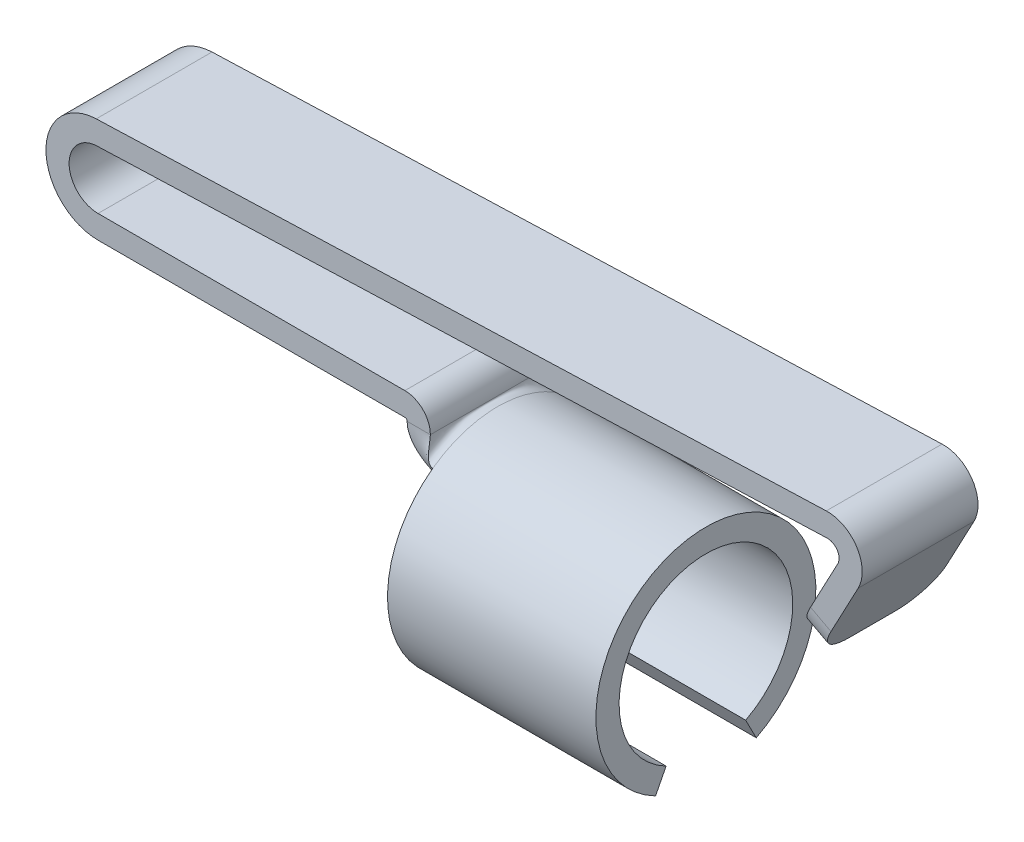
ISO-10303-21;
HEADER;
FILE_DESCRIPTION(('STEP AP214'),'2;1');
FILE_NAME('part.step','',(''),(''),'','','');
FILE_SCHEMA(('AUTOMOTIVE_DESIGN { 1 0 10303 214 1 1 1 1 }'));
ENDSEC;
DATA;
#1=APPLICATION_CONTEXT('core data for automotive mechanical design processes');
#2=APPLICATION_PROTOCOL_DEFINITION('international standard','automotive_design',2000,#1);
#3=PRODUCT_CONTEXT('',#1,'mechanical');
#4=PRODUCT('Part','Part','',(#3));
#5=PRODUCT_RELATED_PRODUCT_CATEGORY('part','',(#4));
#6=PRODUCT_DEFINITION_FORMATION('','',#4);
#7=PRODUCT_DEFINITION_CONTEXT('part definition',#1,'design');
#8=PRODUCT_DEFINITION('design','',#6,#7);
#9=PRODUCT_DEFINITION_SHAPE('','',#8);
#10=(LENGTH_UNIT() NAMED_UNIT(*) SI_UNIT(.MILLI.,.METRE.));
#11=(NAMED_UNIT(*) PLANE_ANGLE_UNIT() SI_UNIT($,.RADIAN.));
#12=(NAMED_UNIT(*) SI_UNIT($,.STERADIAN.) SOLID_ANGLE_UNIT());
#13=UNCERTAINTY_MEASURE_WITH_UNIT(LENGTH_MEASURE(1.E-05),#10,'distance_accuracy_value','');
#14=(GEOMETRIC_REPRESENTATION_CONTEXT(3) GLOBAL_UNCERTAINTY_ASSIGNED_CONTEXT((#13)) GLOBAL_UNIT_ASSIGNED_CONTEXT((#10,
#11,#12)) REPRESENTATION_CONTEXT('',''));
#15=CARTESIAN_POINT('',(0.,0.,0.));
#16=DIRECTION('',(0.,0.,1.));
#17=DIRECTION('',(1.,0.,0.));
#18=AXIS2_PLACEMENT_3D('',#15,#16,#17);
#19=CARTESIAN_POINT('',(7.493,-5.75197248490652,-1.1049));
#20=DIRECTION('',(0.,0.457894736842104,-0.889006417284094));
#21=DIRECTION('',(0.,0.889006417284094,0.457894736842104));
#22=AXIS2_PLACEMENT_3D('',#19,#20,#21);
#23=PLANE('',#22);
#24=DIRECTION('',(1.,0.,0.));
#25=VECTOR('',#24,1.);
#26=CARTESIAN_POINT('',(7.493,-5.3003572249262,-0.872289473684211));
#27=LINE('',#26,#25);
#28=CARTESIAN_POINT('',(12.065,-5.3003572249262,-0.872289473684211));
#29=VERTEX_POINT('',#28);
#30=CARTESIAN_POINT('',(7.493,-5.3003572249262,-0.872289473684211));
#31=VERTEX_POINT('',#30);
#32=EDGE_CURVE('E186',#29,#31,#27,.F.);
#33=ORIENTED_EDGE('',*,*,#32,.T.);
#34=DIRECTION('',(0.,0.889006417284094,0.457894736842104));
#35=VECTOR('',#34,1.);
#36=CARTESIAN_POINT('',(7.493,-5.75197248490652,-1.1049));
#37=LINE('',#36,#35);
#38=CARTESIAN_POINT('',(7.493,-5.75197248490652,-1.1049));
#39=VERTEX_POINT('',#38);
#40=EDGE_CURVE('E181',#39,#31,#37,.T.);
#41=ORIENTED_EDGE('',*,*,#40,.F.);
#42=DIRECTION('',(1.,0.,0.));
#43=VECTOR('',#42,1.);
#44=CARTESIAN_POINT('',(7.493,-5.75197248490652,-1.1049));
#45=LINE('',#44,#43);
#46=CARTESIAN_POINT('',(12.065,-5.75197248490652,-1.1049));
#47=VERTEX_POINT('',#46);
#48=EDGE_CURVE('E167',#47,#39,#45,.F.);
#49=ORIENTED_EDGE('',*,*,#48,.F.);
#50=DIRECTION('',(0.,-0.889006417284094,-0.457894736842104));
#51=VECTOR('',#50,1.);
#52=CARTESIAN_POINT('',(12.065,-5.3003572249262,-0.872289473684211));
#53=LINE('',#52,#51);
#54=EDGE_CURVE('E178',#29,#47,#53,.T.);
#55=ORIENTED_EDGE('',*,*,#54,.F.);
#56=EDGE_LOOP('',(#33,#41,#49,#55));
#57=FACE_BOUND('',#56,.T.);
#58=ADVANCED_FACE('F17',(#57),#23,.F.);
#59=CARTESIAN_POINT('',(7.493,-5.3003572249262,0.87228947368421));
#60=DIRECTION('',(0.,0.457894736842105,0.889006417284093));
#61=DIRECTION('',(0.,-0.889006417284093,0.457894736842105));
#62=AXIS2_PLACEMENT_3D('',#59,#60,#61);
#63=PLANE('',#62);
#64=DIRECTION('',(1.,0.,0.));
#65=VECTOR('',#64,1.);
#66=CARTESIAN_POINT('',(7.493,-5.75197248490652,1.1049));
#67=LINE('',#66,#65);
#68=CARTESIAN_POINT('',(7.493,-5.75197248490652,1.1049));
#69=VERTEX_POINT('',#68);
#70=CARTESIAN_POINT('',(12.065,-5.75197248490652,1.1049));
#71=VERTEX_POINT('',#70);
#72=EDGE_CURVE('E169',#69,#71,#67,.T.);
#73=ORIENTED_EDGE('',*,*,#72,.F.);
#74=DIRECTION('',(0.,0.889006417284093,-0.457894736842105));
#75=VECTOR('',#74,1.);
#76=CARTESIAN_POINT('',(7.493,-5.75197248490652,1.1049));
#77=LINE('',#76,#75);
#78=CARTESIAN_POINT('',(7.493,-5.3003572249262,0.87228947368421));
#79=VERTEX_POINT('',#78);
#80=EDGE_CURVE('E275',#69,#79,#77,.T.);
#81=ORIENTED_EDGE('',*,*,#80,.T.);
#82=DIRECTION('',(1.,0.,0.));
#83=VECTOR('',#82,1.);
#84=CARTESIAN_POINT('',(7.493,-5.3003572249262,0.87228947368421));
#85=LINE('',#84,#83);
#86=CARTESIAN_POINT('',(12.065,-5.3003572249262,0.87228947368421));
#87=VERTEX_POINT('',#86);
#88=EDGE_CURVE('E195',#79,#87,#85,.T.);
#89=ORIENTED_EDGE('',*,*,#88,.T.);
#90=DIRECTION('',(0.,0.889006417284093,-0.457894736842105));
#91=VECTOR('',#90,1.);
#92=CARTESIAN_POINT('',(12.065,-5.75197248490652,1.1049));
#93=LINE('',#92,#91);
#94=EDGE_CURVE('E182',#71,#87,#93,.T.);
#95=ORIENTED_EDGE('',*,*,#94,.F.);
#96=EDGE_LOOP('',(#73,#81,#89,#95));
#97=FACE_BOUND('',#96,.T.);
#98=ADVANCED_FACE('F274',(#97),#63,.F.);
#99=CARTESIAN_POINT('',(12.065,-3.6068,0.));
#100=DIRECTION('',(1.,0.,0.));
#101=DIRECTION('',(0.,0.,-1.));
#102=AXIS2_PLACEMENT_3D('',#99,#100,#101);
#103=PLANE('',#102);
#104=CARTESIAN_POINT('',(12.065,-3.6068,0.));
#105=DIRECTION('',(1.,0.,0.));
#106=DIRECTION('',(0.,0.,-1.));
#107=AXIS2_PLACEMENT_3D('',#104,#105,#106);
#108=CIRCLE('',#107,1.905);
#109=EDGE_CURVE('E185',#87,#29,#108,.F.);
#110=ORIENTED_EDGE('',*,*,#109,.T.);
#111=ORIENTED_EDGE('',*,*,#54,.T.);
#112=CARTESIAN_POINT('',(12.065,-3.6068,0.));
#113=DIRECTION('',(1.,0.,0.));
#114=DIRECTION('',(0.,0.,-1.));
#115=AXIS2_PLACEMENT_3D('',#112,#113,#114);
#116=CIRCLE('',#115,2.413);
#117=EDGE_CURVE('E160',#71,#47,#116,.F.);
#118=ORIENTED_EDGE('',*,*,#117,.F.);
#119=ORIENTED_EDGE('',*,*,#94,.T.);
#120=EDGE_LOOP('',(#110,#111,#118,#119));
#121=FACE_BOUND('',#120,.T.);
#122=ADVANCED_FACE('F184',(#121),#103,.T.);
#123=CARTESIAN_POINT('',(7.493,-3.6068,0.));
#124=DIRECTION('',(1.,0.,0.));
#125=DIRECTION('',(0.,0.,-1.));
#126=AXIS2_PLACEMENT_3D('',#123,#124,#125);
#127=PLANE('',#126);
#128=CARTESIAN_POINT('',(7.493,-3.6068,0.));
#129=DIRECTION('',(1.,0.,0.));
#130=DIRECTION('',(0.,0.,-1.));
#131=AXIS2_PLACEMENT_3D('',#128,#129,#130);
#132=CIRCLE('',#131,1.905);
#133=CARTESIAN_POINT('',(7.493,-2.06624587666632,-1.12058823529412));
#134=VERTEX_POINT('',#133);
#135=EDGE_CURVE('E253',#31,#134,#132,.T.);
#136=ORIENTED_EDGE('',*,*,#135,.T.);
#137=DIRECTION('',(0.,-0.808689828645061,0.588235293947942));
#138=VECTOR('',#137,1.);
#139=CARTESIAN_POINT('',(7.493,-1.65543215417093,-1.41941124783875));
#140=LINE('',#139,#138);
#141=CARTESIAN_POINT('',(7.493,-1.6554316805543,-1.4194115923881));
#142=VERTEX_POINT('',#141);
#143=EDGE_CURVE('E188',#142,#134,#140,.T.);
#144=ORIENTED_EDGE('',*,*,#143,.F.);
#145=CARTESIAN_POINT('',(7.493,-3.6068,0.));
#146=DIRECTION('',(1.,0.,0.));
#147=DIRECTION('',(0.,0.,-1.));
#148=AXIS2_PLACEMENT_3D('',#145,#146,#147);
#149=CIRCLE('',#148,2.413);
#150=EDGE_CURVE('E171',#39,#142,#149,.T.);
#151=ORIENTED_EDGE('',*,*,#150,.F.);
#152=ORIENTED_EDGE('',*,*,#40,.T.);
#153=EDGE_LOOP('',(#136,#144,#151,#152));
#154=FACE_BOUND('',#153,.T.);
#155=ADVANCED_FACE('F304',(#154),#127,.F.);
#156=CARTESIAN_POINT('',(7.493,-3.6068,0.));
#157=DIRECTION('',(1.,0.,0.));
#158=DIRECTION('',(0.,0.,-1.));
#159=AXIS2_PLACEMENT_3D('',#156,#157,#158);
#160=PLANE('',#159);
#161=DIRECTION('',(0.,0.808689828521618,0.588235294117649));
#162=VECTOR('',#161,1.);
#163=CARTESIAN_POINT('',(7.493,-2.06624587666632,1.12058823529412));
#164=LINE('',#163,#162);
#165=CARTESIAN_POINT('',(7.493,-2.06624587666632,1.12058823529412));
#166=VERTEX_POINT('',#165);
#167=CARTESIAN_POINT('',(7.493,-1.65543144377733,1.41941176470588));
#168=VERTEX_POINT('',#167);
#169=EDGE_CURVE('E198',#166,#168,#164,.T.);
#170=ORIENTED_EDGE('',*,*,#169,.F.);
#171=CARTESIAN_POINT('',(7.493,-3.6068,0.));
#172=DIRECTION('',(1.,0.,0.));
#173=DIRECTION('',(0.,0.,-1.));
#174=AXIS2_PLACEMENT_3D('',#171,#172,#173);
#175=CIRCLE('',#174,1.905);
#176=EDGE_CURVE('E251',#166,#79,#175,.T.);
#177=ORIENTED_EDGE('',*,*,#176,.T.);
#178=ORIENTED_EDGE('',*,*,#80,.F.);
#179=CARTESIAN_POINT('',(7.493,-3.6068,0.));
#180=DIRECTION('',(1.,0.,0.));
#181=DIRECTION('',(0.,0.,-1.));
#182=AXIS2_PLACEMENT_3D('',#179,#180,#181);
#183=CIRCLE('',#182,2.413);
#184=EDGE_CURVE('E172',#168,#69,#183,.T.);
#185=ORIENTED_EDGE('',*,*,#184,.F.);
#186=EDGE_LOOP('',(#170,#177,#178,#185));
#187=FACE_BOUND('',#186,.T.);
#188=ADVANCED_FACE('F277',(#187),#160,.F.);
#189=CARTESIAN_POINT('',(7.493,-3.6068,0.));
#190=DIRECTION('',(1.,0.,0.));
#191=DIRECTION('',(0.,0.,-1.));
#192=AXIS2_PLACEMENT_3D('',#189,#190,#191);
#193=CYLINDRICAL_SURFACE('',#192,2.413);
#194=ORIENTED_EDGE('',*,*,#150,.T.);
#195=CARTESIAN_POINT('',(7.493,-1.65543144377733,1.41941176470588));
#196=CARTESIAN_POINT('',(7.493,-1.57851395081652,1.31366769457813));
#197=CARTESIAN_POINT('',(7.493,-1.44390833813508,1.09277437162431));
#198=CARTESIAN_POINT('',(7.493,-1.29968803883354,0.740272726122418));
#199=CARTESIAN_POINT('',(7.493,-1.21315585925262,0.373663306573072));
#200=CARTESIAN_POINT('',(7.493,-1.18431179939231,0.));
#201=CARTESIAN_POINT('',(7.493,-1.21315585925262,-0.373663306573072));
#202=CARTESIAN_POINT('',(7.493,-1.32853209869385,-0.862475865972201));
#203=CARTESIAN_POINT('',(7.493,-1.5015964578557,-1.20792362445037));
#204=CARTESIAN_POINT('',(7.493,-1.65543144377733,-1.41941176470589));
#205=B_SPLINE_CURVE_WITH_KNOTS('',3,(#195,#196,#197,#198,#199,#200,#201,#202,#203,#204),
.UNSPECIFIED.,.F.,.F.,(4,1,1,1,1,1,1,4),(0.,0.125,0.25,0.375,0.5,0.625,0.75,1.),.UNSPECIFIED.);
#206=EDGE_CURVE('E266',#168,#142,#205,.T.);
#207=ORIENTED_EDGE('',*,*,#206,.F.);
#208=ORIENTED_EDGE('',*,*,#184,.T.);
#209=ORIENTED_EDGE('',*,*,#72,.T.);
#210=ORIENTED_EDGE('',*,*,#117,.T.);
#211=ORIENTED_EDGE('',*,*,#48,.T.);
#212=EDGE_LOOP('',(#194,#207,#208,#209,#210,#211));
#213=FACE_BOUND('',#212,.T.);
#214=ADVANCED_FACE('F166',(#213),#193,.T.);
#215=CARTESIAN_POINT('',(7.493,-3.6068,0.));
#216=DIRECTION('',(1.,0.,0.));
#217=DIRECTION('',(0.,0.,-1.));
#218=AXIS2_PLACEMENT_3D('',#215,#216,#217);
#219=CYLINDRICAL_SURFACE('',#218,1.905);
#220=ORIENTED_EDGE('',*,*,#176,.F.);
#221=CARTESIAN_POINT('',(7.493,-2.06624587666632,-1.12058823529412));
#222=CARTESIAN_POINT('',(7.493,-2.0055215401183,-1.03710607466694));
#223=CARTESIAN_POINT('',(7.493,-1.89925395115927,-0.862716609177091));
#224=CARTESIAN_POINT('',(7.493,-1.78539582013175,-0.584425836412436));
#225=CARTESIAN_POINT('',(7.493,-1.71708094151523,-0.294997347294531));
#226=CARTESIAN_POINT('',(7.493,-1.68671877324122,0.0983324490981756));
#227=CARTESIAN_POINT('',(7.493,-1.76262419392624,0.589994694589059));
#228=CARTESIAN_POINT('',(7.493,-1.94479720357029,0.953623914039765));
#229=CARTESIAN_POINT('',(7.493,-2.06624587666632,1.12058823529412));
#230=B_SPLINE_CURVE_WITH_KNOTS('',3,(#221,#222,#223,#224,#225,#226,#227,#228,#229),
.UNSPECIFIED.,.F.,.F.,(4,1,1,1,1,1,4),(0.,0.125,0.25,0.375,0.5,0.75,1.),.UNSPECIFIED.);
#231=EDGE_CURVE('E353',#134,#166,#230,.T.);
#232=ORIENTED_EDGE('',*,*,#231,.F.);
#233=ORIENTED_EDGE('',*,*,#135,.F.);
#234=ORIENTED_EDGE('',*,*,#32,.F.);
#235=ORIENTED_EDGE('',*,*,#109,.F.);
#236=ORIENTED_EDGE('',*,*,#88,.F.);
#237=EDGE_LOOP('',(#220,#232,#233,#234,#235,#236));
#238=FACE_BOUND('',#237,.T.);
#239=ADVANCED_FACE('F299',(#238),#219,.F.);
#240=CARTESIAN_POINT('',(16.2262686885862,0.820788612837237,1.27));
#241=DIRECTION('',(0.882947592858926,-0.469471562785893,0.));
#242=DIRECTION('',(0.469471562785893,0.882947592858926,0.));
#243=AXIS2_PLACEMENT_3D('',#240,#241,#242);
#244=PLANE('',#243);
#245=CARTESIAN_POINT('',(15.6300398038481,-0.300554830093601,-0.508));
#246=DIRECTION('',(-0.882947592858926,0.469471562785892,0.));
#247=DIRECTION('',(-0.469471562785892,-0.882947592858926,0.));
#248=AXIS2_PLACEMENT_3D('',#245,#246,#247);
#249=CIRCLE('',#248,0.762);
#250=CARTESIAN_POINT('',(15.2723024730052,-0.973360895852102,-0.508));
#251=VERTEX_POINT('',#250);
#252=CARTESIAN_POINT('',(15.6300398038481,-0.300554830093601,-1.27));
#253=VERTEX_POINT('',#252);
#254=EDGE_CURVE('E244',#251,#253,#249,.F.);
#255=ORIENTED_EDGE('',*,*,#254,.F.);
#256=DIRECTION('',(0.,0.,1.));
#257=VECTOR('',#256,1.);
#258=CARTESIAN_POINT('',(15.2723024730052,-0.973360895852101,1.27));
#259=LINE('',#258,#257);
#260=CARTESIAN_POINT('',(15.2723024730052,-0.973360895852101,0.508));
#261=VERTEX_POINT('',#260);
#262=EDGE_CURVE('E247',#261,#251,#259,.F.);
#263=ORIENTED_EDGE('',*,*,#262,.F.);
#264=CARTESIAN_POINT('',(15.6300398038481,-0.3005548300936,0.508));
#265=DIRECTION('',(0.882947592858926,-0.469471562785892,0.));
#266=DIRECTION('',(0.469471562785892,0.882947592858926,0.));
#267=AXIS2_PLACEMENT_3D('',#264,#265,#266);
#268=CIRCLE('',#267,0.762);
#269=CARTESIAN_POINT('',(15.6300398038481,-0.3005548300936,1.27));
#270=VERTEX_POINT('',#269);
#271=EDGE_CURVE('E248',#270,#261,#268,.T.);
#272=ORIENTED_EDGE('',*,*,#271,.F.);
#273=DIRECTION('',(0.469471562785893,0.882947592858926,0.));
#274=VECTOR('',#273,1.);
#275=CARTESIAN_POINT('',(16.2262686885862,0.820788612837237,1.27));
#276=LINE('',#275,#274);
#277=CARTESIAN_POINT('',(16.2262686885862,0.820788612837237,1.27));
#278=VERTEX_POINT('',#277);
#279=EDGE_CURVE('E250',#278,#270,#276,.F.);
#280=ORIENTED_EDGE('',*,*,#279,.F.);
#281=DIRECTION('',(0.,0.,-1.));
#282=VECTOR('',#281,1.);
#283=CARTESIAN_POINT('',(16.2262686885862,0.820788612837239,1.27));
#284=LINE('',#283,#282);
#285=CARTESIAN_POINT('',(16.2262686885862,0.820788612837237,-1.27));
#286=VERTEX_POINT('',#285);
#287=EDGE_CURVE('E240',#278,#286,#284,.T.);
#288=ORIENTED_EDGE('',*,*,#287,.T.);
#289=DIRECTION('',(0.469471562785893,0.882947592858926,0.));
#290=VECTOR('',#289,1.);
#291=CARTESIAN_POINT('',(16.2262686885862,0.820788612837237,-1.27));
#292=LINE('',#291,#290);
#293=EDGE_CURVE('E246',#253,#286,#292,.T.);
#294=ORIENTED_EDGE('',*,*,#293,.F.);
#295=EDGE_LOOP('',(#255,#263,#272,#280,#288,#294));
#296=FACE_BOUND('',#295,.T.);
#297=ADVANCED_FACE('F321',(#296),#244,.F.);
#298=CARTESIAN_POINT('',(7.2898,-1.1938,-1.27));
#299=CARTESIAN_POINT('',(7.29591950625445,-1.36903973106871,-1.27));
#300=CARTESIAN_POINT('',(7.31765345255229,-1.65543144377733,-1.41941176470589));
#301=CARTESIAN_POINT('',(7.493,-1.65543144377733,-1.41941176470589));
#302=CARTESIAN_POINT('',(7.2898,-1.1938,-1.05833333333333));
#303=CARTESIAN_POINT('',(7.29463998980931,-1.33245143373405,-1.05833150838552));
#304=CARTESIAN_POINT('',(7.35426405207499,-1.5015964578557,-1.20792362445037));
#305=CARTESIAN_POINT('',(7.493,-1.5015964578557,-1.20792362445037));
#306=CARTESIAN_POINT('',(7.2898,-1.1938,-0.740833333333333));
#307=CARTESIAN_POINT('',(7.29272071514161,-1.27756898773207,-0.7408287709638));
#308=CARTESIAN_POINT('',(7.40917995135904,-1.32853209869385,-0.862475865972201));
#309=CARTESIAN_POINT('',(7.493,-1.32853209869385,-0.862475865972201));
#310=CARTESIAN_POINT('',(7.2898,-1.1938,-0.3175));
#311=CARTESIAN_POINT('',(7.29223178632728,-1.2632020806928,-0.317508212265159));
#312=CARTESIAN_POINT('',(7.42355561566459,-1.21315585925262,-0.373663306573072));
#313=CARTESIAN_POINT('',(7.493,-1.21315585925262,-0.373663306573072));
#314=CARTESIAN_POINT('',(7.2898,-1.1938,0.));
#315=CARTESIAN_POINT('',(7.29210615284979,-1.26074105638537,3.14803497769103E-05));
#316=CARTESIAN_POINT('',(7.42601814007536,-1.18431179939231,0.));
#317=CARTESIAN_POINT('',(7.493,-1.18431179939231,0.));
#318=CARTESIAN_POINT('',(7.2898,-1.1938,0.3175));
#319=CARTESIAN_POINT('',(7.29232676048123,-1.26278620455215,0.317382290866052));
#320=CARTESIAN_POINT('',(7.42397174530017,-1.21315585925262,0.373663306573072));
#321=CARTESIAN_POINT('',(7.493,-1.21315585925262,0.373663306573072));
#322=CARTESIAN_POINT('',(7.2898,-1.1938,0.635));
#323=CARTESIAN_POINT('',(7.29221858632226,-1.27564076553488,0.635439356186016));
#324=CARTESIAN_POINT('',(7.41110934889308,-1.29968803883354,0.740272726122418));
#325=CARTESIAN_POINT('',(7.493,-1.29968803883354,0.740272726122418));
#326=CARTESIAN_POINT('',(7.2898,-1.1938,0.9525));
#327=CARTESIAN_POINT('',(7.2954248438959,-1.30791914295686,0.950860284389884));
#328=CARTESIAN_POINT('',(7.37881129637017,-1.44390833813508,1.09277437162431));
#329=CARTESIAN_POINT('',(7.493,-1.44390833813508,1.09277437162431));
#330=CARTESIAN_POINT('',(7.2898,-1.1938,1.16416666666667));
#331=CARTESIAN_POINT('',(7.2916749479653,-1.34866620169809,1.16769976563293));
#332=CARTESIAN_POINT('',(7.33803940049159,-1.57851395081652,1.31366769457813));
#333=CARTESIAN_POINT('',(7.493,-1.57851395081652,1.31366769457813));
#334=CARTESIAN_POINT('',(7.2898,-1.1938,1.27));
#335=CARTESIAN_POINT('',(7.2898,-1.36903973106871,1.27611950625445));
#336=CARTESIAN_POINT('',(7.31765345255229,-1.65543144377733,1.41941176470588));
#337=CARTESIAN_POINT('',(7.493,-1.65543144377733,1.41941176470588));
#338=B_SPLINE_SURFACE_WITH_KNOTS('',3,3,((#298,#299,#300,#301),(#302,#303,#304,#305),(#306,#307,
#308,#309),(#310,#311,#312,#313),(#314,#315,#316,#317),(#318,#319,#320,#321),(#322,#323,#324,
#325),(#326,#327,#328,#329),(#330,#331,#332,#333),(#334,#335,#336,#337)),.UNSPECIFIED.,.F.,.F.,
.F.,(4,1,1,1,1,1,1,4),(4,4),(0.,0.25,0.375,0.5,0.625,0.75,0.875,1.),(0.,1.),.UNSPECIFIED.);
#339=CARTESIAN_POINT('',(7.2898,-1.1938,-1.27));
#340=CARTESIAN_POINT('',(7.29591950625445,-1.36903973106871,-1.27));
#341=CARTESIAN_POINT('',(7.31765345255229,-1.65543144377733,-1.41941176470589));
#342=CARTESIAN_POINT('',(7.493,-1.65543144377733,-1.41941176470589));
#343=B_SPLINE_CURVE_WITH_KNOTS('',3,(#339,#340,#341,#342),.UNSPECIFIED.,.F.,.F.,(4,4),(0.,1.),.UNSPECIFIED.);
#344=CARTESIAN_POINT('',(7.2898,-1.1938,-1.27));
#345=VERTEX_POINT('',#344);
#346=EDGE_CURVE('E384',#142,#345,#343,.F.);
#347=DIRECTION('',(0.,0.,1.));
#348=VECTOR('',#347,1.);
#349=CARTESIAN_POINT('',(7.2898,-1.1938,1.38722002645864));
#350=LINE('',#349,#348);
#351=CARTESIAN_POINT('',(7.2898,-1.1938,1.27));
#352=VERTEX_POINT('',#351);
#353=EDGE_CURVE('E234',#352,#345,#350,.F.);
#354=CARTESIAN_POINT('',(7.2898,-1.1938,1.27));
#355=CARTESIAN_POINT('',(7.2898,-1.36903973106871,1.27611950625445));
#356=CARTESIAN_POINT('',(7.31765345255229,-1.65543144377733,1.41941176470588));
#357=CARTESIAN_POINT('',(7.493,-1.65543144377733,1.41941176470588));
#358=B_SPLINE_CURVE_WITH_KNOTS('',3,(#354,#355,#356,#357),.UNSPECIFIED.,.F.,.F.,(4,4),(0.,1.),.UNSPECIFIED.);
#359=EDGE_CURVE('E369',#352,#168,#358,.T.);
#360=ORIENTED_EDGE('',*,*,#206,.T.);
#361=ORIENTED_EDGE('',*,*,#346,.T.);
#362=ORIENTED_EDGE('',*,*,#353,.F.);
#363=ORIENTED_EDGE('',*,*,#359,.T.);
#364=EDGE_LOOP('',(#360,#361,#362,#363));
#365=FACE_BOUND('',#364,.T.);
#366=ADVANCED_FACE('F314',(#365),#338,.T.);
#367=CARTESIAN_POINT('',(6.7818,-1.1938,1.27));
#368=CARTESIAN_POINT('',(6.76859089460419,-1.57205928775501,1.27));
#369=CARTESIAN_POINT('',(7.11451014645266,-2.06624587666632,1.12058823529412));
#370=CARTESIAN_POINT('',(7.493,-2.06624587666632,1.12058823529412));
#371=CARTESIAN_POINT('',(6.7818,-1.1938,1.05833333333333));
#372=CARTESIAN_POINT('',(6.76949594362787,-1.54571174556917,1.05834836075699));
#373=CARTESIAN_POINT('',(7.14087374863264,-1.94479720357029,0.953623914039765));
#374=CARTESIAN_POINT('',(7.493,-1.94479720357029,0.953623914039765));
#375=CARTESIAN_POINT('',(6.7818,-1.1938,0.635));
#376=CARTESIAN_POINT('',(6.77130604167525,-1.49301666119748,0.635045082270975));
#377=CARTESIAN_POINT('',(7.19360095299258,-1.76262419392624,0.589994694589059));
#378=CARTESIAN_POINT('',(7.493,-1.76262419392624,0.589994694589059));
#379=CARTESIAN_POINT('',(6.7818,-1.1938,0.105833333333333));
#380=CARTESIAN_POINT('',(6.77186053290836,-1.48251722367898,0.105690572808578));
#381=CARTESIAN_POINT('',(7.20410679038336,-1.68671877324122,0.0983324490981756));
#382=CARTESIAN_POINT('',(7.493,-1.68671877324122,0.0983324490981756));
#383=CARTESIAN_POINT('',(6.7818,-1.1938,-0.3175));
#384=CARTESIAN_POINT('',(6.77128577755434,-1.48778750671068,-0.317252047509635));
#385=CARTESIAN_POINT('',(7.19883329488067,-1.71708094151523,-0.294997347294531));
#386=CARTESIAN_POINT('',(7.493,-1.71708094151523,-0.294997347294531));
#387=CARTESIAN_POINT('',(6.7818,-1.1938,-0.635));
#388=CARTESIAN_POINT('',(6.77197288719171,-1.50232242535237,-0.635946727690484));
#389=CARTESIAN_POINT('',(7.1842895165622,-1.78539582013175,-0.584425836412436));
#390=CARTESIAN_POINT('',(7.493,-1.78539582013175,-0.584425836412436));
#391=CARTESIAN_POINT('',(6.7818,-1.1938,-0.9525));
#392=CARTESIAN_POINT('',(6.766609166139,-1.52746606060004,-0.948961041728428));
#393=CARTESIAN_POINT('',(7.15913055515502,-1.89925395115927,-0.862716609177091));
#394=CARTESIAN_POINT('',(7.493,-1.89925395115927,-0.862716609177091));
#395=CARTESIAN_POINT('',(6.7818,-1.1938,-1.16416666666667));
#396=CARTESIAN_POINT('',(6.77673638871299,-1.55719487870336,-1.17179308417335));
#397=CARTESIAN_POINT('',(7.12938361602011,-2.0055215401183,-1.03710607466694));
#398=CARTESIAN_POINT('',(7.493,-2.0055215401183,-1.03710607466694));
#399=CARTESIAN_POINT('',(6.7818,-1.1938,-1.27));
#400=CARTESIAN_POINT('',(6.7818,-1.57205928775501,-1.28320910539581));
#401=CARTESIAN_POINT('',(7.11451014645266,-2.06624587666632,-1.12058823529412));
#402=CARTESIAN_POINT('',(7.493,-2.06624587666632,-1.12058823529412));
#403=B_SPLINE_SURFACE_WITH_KNOTS('',3,3,((#367,#368,#369,#370),(#371,#372,#373,#374),(#375,#376,
#377,#378),(#379,#380,#381,#382),(#383,#384,#385,#386),(#387,#388,#389,#390),(#391,#392,#393,
#394),(#395,#396,#397,#398),(#399,#400,#401,#402)),.UNSPECIFIED.,.F.,.F.,.F.,(4,1,1,1,1,1,4),(4,
4),(0.,0.25,0.5,0.625,0.75,0.875,1.),(0.,1.),.UNSPECIFIED.);
#404=CARTESIAN_POINT('',(6.7818,-1.1938,1.27));
#405=CARTESIAN_POINT('',(6.76859089460419,-1.57205928775501,1.27));
#406=CARTESIAN_POINT('',(7.11451014645266,-2.06624587666632,1.12058823529412));
#407=CARTESIAN_POINT('',(7.493,-2.06624587666632,1.12058823529412));
#408=B_SPLINE_CURVE_WITH_KNOTS('',3,(#404,#405,#406,#407),.UNSPECIFIED.,.F.,.F.,(4,4),(0.,1.),.UNSPECIFIED.);
#409=CARTESIAN_POINT('',(6.7818,-1.1938,1.27));
#410=VERTEX_POINT('',#409);
#411=EDGE_CURVE('E243',#166,#410,#408,.F.);
#412=DIRECTION('',(0.,0.,1.));
#413=VECTOR('',#412,1.);
#414=CARTESIAN_POINT('',(6.7818,-1.1938,1.38722002645864));
#415=LINE('',#414,#413);
#416=CARTESIAN_POINT('',(6.7818,-1.1938,-1.27));
#417=VERTEX_POINT('',#416);
#418=EDGE_CURVE('E225',#410,#417,#415,.F.);
#419=CARTESIAN_POINT('',(6.7818,-1.1938,-1.27));
#420=CARTESIAN_POINT('',(6.7818,-1.57205928775501,-1.28320910539581));
#421=CARTESIAN_POINT('',(7.11451014645266,-2.06624587666632,-1.12058823529412));
#422=CARTESIAN_POINT('',(7.493,-2.06624587666632,-1.12058823529412));
#423=B_SPLINE_CURVE_WITH_KNOTS('',3,(#419,#420,#421,#422),.UNSPECIFIED.,.F.,.F.,(4,4),(0.,1.),.UNSPECIFIED.);
#424=EDGE_CURVE('E389',#417,#134,#423,.T.);
#425=ORIENTED_EDGE('',*,*,#231,.T.);
#426=ORIENTED_EDGE('',*,*,#411,.T.);
#427=ORIENTED_EDGE('',*,*,#418,.T.);
#428=ORIENTED_EDGE('',*,*,#424,.T.);
#429=EDGE_LOOP('',(#425,#426,#427,#428));
#430=FACE_BOUND('',#429,.T.);
#431=ADVANCED_FACE('F320',(#430),#403,.T.);
#432=CARTESIAN_POINT('',(16.002,0.940034389784854,1.27));
#433=DIRECTION('',(0.,0.,-1.));
#434=DIRECTION('',(-1.,0.,0.));
#435=AXIS2_PLACEMENT_3D('',#432,#433,#434);
#436=CYLINDRICAL_SURFACE('',#435,0.254000000000001);
#437=ORIENTED_EDGE('',*,*,#287,.F.);
#438=CARTESIAN_POINT('',(16.002,0.940034389784854,1.27));
#439=DIRECTION('',(0.,0.,-1.));
#440=DIRECTION('',(-1.,0.,0.));
#441=AXIS2_PLACEMENT_3D('',#438,#439,#440);
#442=CIRCLE('',#441,0.254000000000001);
#443=CARTESIAN_POINT('',(15.9931355278376,1.1938796598477,1.27));
#444=VERTEX_POINT('',#443);
#445=EDGE_CURVE('E241',#444,#278,#442,.T.);
#446=ORIENTED_EDGE('',*,*,#445,.F.);
#447=DIRECTION('',(0.,0.,1.));
#448=VECTOR('',#447,1.);
#449=CARTESIAN_POINT('',(15.9931355278376,1.1938796598477,1.27));
#450=LINE('',#449,#448);
#451=CARTESIAN_POINT('',(15.9931355278376,1.1938796598477,-1.27));
#452=VERTEX_POINT('',#451);
#453=EDGE_CURVE('E423',#444,#452,#450,.F.);
#454=ORIENTED_EDGE('',*,*,#453,.T.);
#455=CARTESIAN_POINT('',(16.002,0.940034389784854,-1.27));
#456=DIRECTION('',(0.,0.,-1.));
#457=DIRECTION('',(-1.,0.,0.));
#458=AXIS2_PLACEMENT_3D('',#455,#456,#457);
#459=CIRCLE('',#458,0.254000000000001);
#460=EDGE_CURVE('E238',#286,#452,#459,.F.);
#461=ORIENTED_EDGE('',*,*,#460,.F.);
#462=EDGE_LOOP('',(#437,#446,#454,#461));
#463=FACE_BOUND('',#462,.T.);
#464=ADVANCED_FACE('F572',(#463),#436,.F.);
#465=CARTESIAN_POINT('',(6.731,-1.1938,1.38722002645864));
#466=DIRECTION('',(0.,0.,1.));
#467=DIRECTION('',(1.,0.,0.));
#468=AXIS2_PLACEMENT_3D('',#465,#466,#467);
#469=CYLINDRICAL_SURFACE('',#468,0.5588);
#470=CARTESIAN_POINT('',(6.731,-1.1938,-1.27));
#471=DIRECTION('',(0.,0.,1.));
#472=DIRECTION('',(1.,0.,0.));
#473=AXIS2_PLACEMENT_3D('',#470,#471,#472);
#474=CIRCLE('',#473,0.5588);
#475=CARTESIAN_POINT('',(6.731,-0.635,-1.27));
#476=VERTEX_POINT('',#475);
#477=EDGE_CURVE('E232',#345,#476,#474,.T.);
#478=ORIENTED_EDGE('',*,*,#477,.T.);
#479=DIRECTION('',(0.,0.,-1.));
#480=VECTOR('',#479,1.);
#481=CARTESIAN_POINT('',(6.731,-0.635,1.27));
#482=LINE('',#481,#480);
#483=CARTESIAN_POINT('',(6.731,-0.635,1.27));
#484=VERTEX_POINT('',#483);
#485=EDGE_CURVE('E426',#476,#484,#482,.F.);
#486=ORIENTED_EDGE('',*,*,#485,.T.);
#487=CARTESIAN_POINT('',(6.731,-1.1938,1.27));
#488=DIRECTION('',(0.,0.,1.));
#489=DIRECTION('',(1.,0.,0.));
#490=AXIS2_PLACEMENT_3D('',#487,#488,#489);
#491=CIRCLE('',#490,0.5588);
#492=EDGE_CURVE('E235',#484,#352,#491,.F.);
#493=ORIENTED_EDGE('',*,*,#492,.T.);
#494=ORIENTED_EDGE('',*,*,#353,.T.);
#495=EDGE_LOOP('',(#478,#486,#493,#494));
#496=FACE_BOUND('',#495,.T.);
#497=ADVANCED_FACE('F568',(#496),#469,.T.);
#498=CARTESIAN_POINT('',(0.,0.,1.27));
#499=DIRECTION('',(0.,0.,-1.));
#500=DIRECTION('',(-1.,0.,0.));
#501=AXIS2_PLACEMENT_3D('',#498,#499,#500);
#502=CYLINDRICAL_SURFACE('',#501,0.635);
#503=CARTESIAN_POINT('',(0.,0.,1.27));
#504=DIRECTION('',(0.,0.,-1.));
#505=DIRECTION('',(-1.,0.,0.));
#506=AXIS2_PLACEMENT_3D('',#503,#504,#505);
#507=CIRCLE('',#506,0.635);
#508=CARTESIAN_POINT('',(0.,-0.635,1.27));
#509=VERTEX_POINT('',#508);
#510=CARTESIAN_POINT('',(-0.0221611804060892,0.634613175157126,1.27));
#511=VERTEX_POINT('',#510);
#512=EDGE_CURVE('E228',#509,#511,#507,.T.);
#513=ORIENTED_EDGE('',*,*,#512,.F.);
#514=DIRECTION('',(0.,0.,-1.));
#515=VECTOR('',#514,1.);
#516=CARTESIAN_POINT('',(0.,-0.635,1.27));
#517=LINE('',#516,#515);
#518=CARTESIAN_POINT('',(0.,-0.635,-1.27));
#519=VERTEX_POINT('',#518);
#520=EDGE_CURVE('E429',#509,#519,#517,.T.);
#521=ORIENTED_EDGE('',*,*,#520,.T.);
#522=CARTESIAN_POINT('',(0.,0.,-1.27));
#523=DIRECTION('',(0.,0.,-1.));
#524=DIRECTION('',(-1.,0.,0.));
#525=AXIS2_PLACEMENT_3D('',#522,#523,#524);
#526=CIRCLE('',#525,0.635);
#527=CARTESIAN_POINT('',(-0.0221611804060892,0.634613175157126,-1.27));
#528=VERTEX_POINT('',#527);
#529=EDGE_CURVE('E230',#528,#519,#526,.F.);
#530=ORIENTED_EDGE('',*,*,#529,.F.);
#531=DIRECTION('',(0.,0.,1.));
#532=VECTOR('',#531,1.);
#533=CARTESIAN_POINT('',(-0.0221611804060904,0.634613175157126,1.27));
#534=LINE('',#533,#532);
#535=EDGE_CURVE('E412',#528,#511,#534,.T.);
#536=ORIENTED_EDGE('',*,*,#535,.T.);
#537=EDGE_LOOP('',(#513,#521,#530,#536));
#538=FACE_BOUND('',#537,.T.);
#539=ADVANCED_FACE('F565',(#538),#502,.F.);
#540=CARTESIAN_POINT('',(6.731,-1.1938,1.38722002645864));
#541=DIRECTION('',(0.,0.,1.));
#542=DIRECTION('',(1.,0.,0.));
#543=AXIS2_PLACEMENT_3D('',#540,#541,#542);
#544=CYLINDRICAL_SURFACE('',#543,0.0508000000000002);
#545=ORIENTED_EDGE('',*,*,#418,.F.);
#546=CARTESIAN_POINT('',(6.731,-1.1938,1.27));
#547=DIRECTION('',(0.,0.,1.));
#548=DIRECTION('',(1.,0.,0.));
#549=AXIS2_PLACEMENT_3D('',#546,#547,#548);
#550=CIRCLE('',#549,0.0508000000000002);
#551=CARTESIAN_POINT('',(6.731,-1.143,1.27));
#552=VERTEX_POINT('',#551);
#553=EDGE_CURVE('E226',#552,#410,#550,.F.);
#554=ORIENTED_EDGE('',*,*,#553,.F.);
#555=DIRECTION('',(0.,0.,-1.));
#556=VECTOR('',#555,1.);
#557=CARTESIAN_POINT('',(6.731,-1.143,1.27));
#558=LINE('',#557,#556);
#559=CARTESIAN_POINT('',(6.731,-1.143,-1.27));
#560=VERTEX_POINT('',#559);
#561=EDGE_CURVE('E432',#560,#552,#558,.F.);
#562=ORIENTED_EDGE('',*,*,#561,.F.);
#563=CARTESIAN_POINT('',(6.731,-1.1938,-1.27));
#564=DIRECTION('',(0.,0.,1.));
#565=DIRECTION('',(1.,0.,0.));
#566=AXIS2_PLACEMENT_3D('',#563,#564,#565);
#567=CIRCLE('',#566,0.0508000000000002);
#568=EDGE_CURVE('E222',#417,#560,#567,.T.);
#569=ORIENTED_EDGE('',*,*,#568,.F.);
#570=EDGE_LOOP('',(#545,#554,#562,#569));
#571=FACE_BOUND('',#570,.T.);
#572=ADVANCED_FACE('F516',(#571),#544,.F.);
#573=CARTESIAN_POINT('',(15.7208398501776,-1.21185244974733,1.27));
#574=DIRECTION('',(-0.469471562785892,-0.882947592858926,0.));
#575=DIRECTION('',(0.882947592858926,-0.469471562785892,0.));
#576=AXIS2_PLACEMENT_3D('',#573,#574,#575);
#577=PLANE('',#576);
#578=DIRECTION('',(0.,0.,1.));
#579=VECTOR('',#578,1.);
#580=CARTESIAN_POINT('',(15.7208398501776,-1.21185244974733,1.27));
#581=LINE('',#580,#579);
#582=CARTESIAN_POINT('',(15.7208398501776,-1.21185244974733,0.508));
#583=VERTEX_POINT('',#582);
#584=CARTESIAN_POINT('',(15.7208398501776,-1.21185244974734,-0.508));
#585=VERTEX_POINT('',#584);
#586=EDGE_CURVE('E221',#583,#585,#581,.F.);
#587=ORIENTED_EDGE('',*,*,#586,.F.);
#588=DIRECTION('',(0.882947592858926,-0.469471562785892,0.));
#589=VECTOR('',#588,1.);
#590=CARTESIAN_POINT('',(15.7208398501776,-1.21185244974733,0.508));
#591=LINE('',#590,#589);
#592=EDGE_CURVE('E413',#261,#583,#591,.T.);
#593=ORIENTED_EDGE('',*,*,#592,.F.);
#594=ORIENTED_EDGE('',*,*,#262,.T.);
#595=DIRECTION('',(-0.882947592858926,0.469471562785892,0.));
#596=VECTOR('',#595,1.);
#597=CARTESIAN_POINT('',(15.0480337844191,-0.854115118904485,-0.508));
#598=LINE('',#597,#596);
#599=EDGE_CURVE('E224',#585,#251,#598,.T.);
#600=ORIENTED_EDGE('',*,*,#599,.F.);
#601=EDGE_LOOP('',(#587,#593,#594,#600));
#602=FACE_BOUND('',#601,.T.);
#603=ADVANCED_FACE('F490',(#602),#577,.T.);
#604=CARTESIAN_POINT('',(15.4057711152619,-0.181309053145983,-0.508));
#605=DIRECTION('',(-0.882947592858926,0.469471562785892,0.));
#606=DIRECTION('',(-0.469471562785892,-0.882947592858926,0.));
#607=AXIS2_PLACEMENT_3D('',#604,#605,#606);
#608=CYLINDRICAL_SURFACE('',#607,0.762);
#609=ORIENTED_EDGE('',*,*,#254,.T.);
#610=DIRECTION('',(-0.882947592858926,0.469471562785892,0.));
#611=VECTOR('',#610,1.);
#612=CARTESIAN_POINT('',(16.0785771810204,-0.539046383988833,-1.27));
#613=LINE('',#612,#611);
#614=CARTESIAN_POINT('',(16.0785771810204,-0.539046383988834,-1.27));
#615=VERTEX_POINT('',#614);
#616=EDGE_CURVE('E417',#615,#253,#613,.T.);
#617=ORIENTED_EDGE('',*,*,#616,.F.);
#618=CARTESIAN_POINT('',(16.0785771810204,-0.539046383988834,-0.508));
#619=DIRECTION('',(-0.882947592858926,0.469471562785892,0.));
#620=DIRECTION('',(-0.469471562785892,-0.882947592858926,0.));
#621=AXIS2_PLACEMENT_3D('',#618,#619,#620);
#622=CIRCLE('',#621,0.762);
#623=EDGE_CURVE('E219',#585,#615,#622,.F.);
#624=ORIENTED_EDGE('',*,*,#623,.F.);
#625=ORIENTED_EDGE('',*,*,#599,.T.);
#626=EDGE_LOOP('',(#609,#617,#624,#625));
#627=FACE_BOUND('',#626,.T.);
#628=ADVANCED_FACE('F493',(#627),#608,.T.);
#629=CARTESIAN_POINT('',(6.7818,-1.1938,-1.27));
#630=CARTESIAN_POINT('',(6.7818,-1.57205928775501,-1.28320910539581));
#631=CARTESIAN_POINT('',(7.11451014645266,-2.06624587666632,-1.12058823529412));
#632=CARTESIAN_POINT('',(7.493,-2.06624587666632,-1.12058823529412));
#633=CARTESIAN_POINT('',(6.82413333333333,-1.1938,-1.27));
#634=CARTESIAN_POINT('',(6.82412637143771,-1.55347992900878,-1.28256726178735));
#635=CARTESIAN_POINT('',(7.1331008301411,-2.03201134059223,-1.14549019607843));
#636=CARTESIAN_POINT('',(7.493,-2.03201134059223,-1.14549019607843));
#637=CARTESIAN_POINT('',(6.9088,-1.1938,-1.27));
#638=CARTESIAN_POINT('',(6.90877911431313,-1.51632121151631,-1.28128357457043));
#639=CARTESIAN_POINT('',(7.17028219751796,-1.96354226844407,-1.19529411764706));
#640=CARTESIAN_POINT('',(7.493,-1.96354226844407,-1.19529411764706));
#641=CARTESIAN_POINT('',(7.01463333333333,-1.1938,-1.27));
#642=CARTESIAN_POINT('',(7.01469947134177,-1.47163766571343,-1.27963616707207));
#643=CARTESIAN_POINT('',(7.21499297992144,-1.87795592825887,-1.25754901960784));
#644=CARTESIAN_POINT('',(7.493,-1.87795592825887,-1.25754901960784));
#645=CARTESIAN_POINT('',(7.0993,-1.1938,-1.27));
#646=CARTESIAN_POINT('',(7.09918512872219,-1.4373809390061,-1.27862090510143));
#647=CARTESIAN_POINT('',(7.24927058762123,-1.8094868561107,-1.30735294117647));
#648=CARTESIAN_POINT('',(7.493,-1.8094868561107,-1.30735294117647));
#649=CARTESIAN_POINT('',(7.1628,-1.1938,-1.27));
#650=CARTESIAN_POINT('',(7.16323859942438,-1.41282103385677,-1.27720978361278));
#651=CARTESIAN_POINT('',(7.27384546312071,-1.75813505199958,-1.34470588235294));
#652=CARTESIAN_POINT('',(7.493,-1.75813505199958,-1.34470588235294));
#653=CARTESIAN_POINT('',(7.2263,-1.1938,-1.27));
#654=CARTESIAN_POINT('',(7.22466047358029,-1.38952014764914,-1.27847422458065));
#655=CARTESIAN_POINT('',(7.29716055225071,-1.70678324788846,-1.38205882352941));
#656=CARTESIAN_POINT('',(7.493,-1.70678324788846,-1.38205882352941));
#657=CARTESIAN_POINT('',(7.26863333333333,-1.1938,-1.27));
#658=CARTESIAN_POINT('',(7.27216649536305,-1.37586653659552,-1.27282474152688));
#659=CARTESIAN_POINT('',(7.31082248578509,-1.67254871181437,-1.40696078431373));
#660=CARTESIAN_POINT('',(7.493,-1.67254871181437,-1.40696078431373));
#661=CARTESIAN_POINT('',(7.2898,-1.1938,-1.27));
#662=CARTESIAN_POINT('',(7.29591950625445,-1.36903973106871,-1.27));
#663=CARTESIAN_POINT('',(7.31765345255229,-1.65543144377733,-1.41941176470589));
#664=CARTESIAN_POINT('',(7.493,-1.65543144377733,-1.41941176470588));
#665=B_SPLINE_SURFACE_WITH_KNOTS('',3,3,((#629,#630,#631,#632),(#633,#634,#635,#636),(#637,#638,
#639,#640),(#641,#642,#643,#644),(#645,#646,#647,#648),(#649,#650,#651,#652),(#653,#654,#655,
#656),(#657,#658,#659,#660),(#661,#662,#663,#664)),.UNSPECIFIED.,.F.,.F.,.F.,(4,1,1,1,1,1,4),(4,
4),(0.,0.25,0.5,0.625,0.75,0.875,1.),(0.,1.),.UNSPECIFIED.);
#666=DIRECTION('',(-1.,0.,0.));
#667=VECTOR('',#666,1.);
#668=CARTESIAN_POINT('',(16.002,-1.1938,-1.27));
#669=LINE('',#668,#667);
#670=EDGE_CURVE('E451',#345,#417,#669,.T.);
#671=ORIENTED_EDGE('',*,*,#143,.T.);
#672=ORIENTED_EDGE('',*,*,#424,.F.);
#673=ORIENTED_EDGE('',*,*,#670,.F.);
#674=ORIENTED_EDGE('',*,*,#346,.F.);
#675=EDGE_LOOP('',(#671,#672,#673,#674));
#676=FACE_BOUND('',#675,.T.);
#677=ADVANCED_FACE('F522',(#676),#665,.T.);
#678=CARTESIAN_POINT('',(-0.0221611804060904,0.634613175157126,1.27));
#679=DIRECTION('',(-0.0348994967025044,0.999390827019096,0.));
#680=DIRECTION('',(-0.999390827019096,-0.0348994967025044,0.));
#681=AXIS2_PLACEMENT_3D('',#678,#679,#680);
#682=PLANE('',#681);
#683=ORIENTED_EDGE('',*,*,#453,.F.);
#684=DIRECTION('',(-0.999390827019096,-0.0348994967025045,0.));
#685=VECTOR('',#684,1.);
#686=CARTESIAN_POINT('',(15.9931355278376,1.19387965984771,1.27));
#687=LINE('',#686,#685);
#688=EDGE_CURVE('E213',#444,#511,#687,.T.);
#689=ORIENTED_EDGE('',*,*,#688,.T.);
#690=ORIENTED_EDGE('',*,*,#535,.F.);
#691=DIRECTION('',(-0.999390827019096,-0.0348994967025045,0.));
#692=VECTOR('',#691,1.);
#693=CARTESIAN_POINT('',(15.9931355278376,1.19387965984771,-1.27));
#694=LINE('',#693,#692);
#695=EDGE_CURVE('E420',#452,#528,#694,.T.);
#696=ORIENTED_EDGE('',*,*,#695,.F.);
#697=EDGE_LOOP('',(#683,#689,#690,#696));
#698=FACE_BOUND('',#697,.T.);
#699=ADVANCED_FACE('F554',(#698),#682,.F.);
#700=CARTESIAN_POINT('',(0.,-0.635,1.27));
#701=DIRECTION('',(0.,-1.,0.));
#702=DIRECTION('',(0.,0.,-1.));
#703=AXIS2_PLACEMENT_3D('',#700,#701,#702);
#704=PLANE('',#703);
#705=ORIENTED_EDGE('',*,*,#520,.F.);
#706=DIRECTION('',(-1.,0.,0.));
#707=VECTOR('',#706,1.);
#708=CARTESIAN_POINT('',(16.002,-0.635,1.27));
#709=LINE('',#708,#707);
#710=EDGE_CURVE('E465',#509,#484,#709,.F.);
#711=ORIENTED_EDGE('',*,*,#710,.T.);
#712=ORIENTED_EDGE('',*,*,#485,.F.);
#713=DIRECTION('',(-1.,0.,0.));
#714=VECTOR('',#713,1.);
#715=CARTESIAN_POINT('',(16.002,-0.635,-1.27));
#716=LINE('',#715,#714);
#717=EDGE_CURVE('E448',#519,#476,#716,.F.);
#718=ORIENTED_EDGE('',*,*,#717,.F.);
#719=EDGE_LOOP('',(#705,#711,#712,#718));
#720=FACE_BOUND('',#719,.T.);
#721=ADVANCED_FACE('F551',(#720),#704,.F.);
#722=CARTESIAN_POINT('',(7.2898,-1.1938,1.27));
#723=CARTESIAN_POINT('',(7.2898,-1.36903973106871,1.27611950625445));
#724=CARTESIAN_POINT('',(7.31765345255229,-1.65543144377733,1.41941176470589));
#725=CARTESIAN_POINT('',(7.493,-1.65543144377733,1.41941176470588));
#726=CARTESIAN_POINT('',(7.24746666666667,-1.1938,1.27));
#727=CARTESIAN_POINT('',(7.24748169409032,-1.38321701241019,1.27662961525185));
#728=CARTESIAN_POINT('',(7.3034675295298,-1.68966597985142,1.39450980392157));
#729=CARTESIAN_POINT('',(7.493,-1.68966597985142,1.39450980392157));
#730=CARTESIAN_POINT('',(7.1628,-1.1938,1.27));
#731=CARTESIAN_POINT('',(7.16284508227098,-1.41157157509315,1.27764983324666));
#732=CARTESIAN_POINT('',(7.27509568348482,-1.75813505199958,1.34470588235294));
#733=CARTESIAN_POINT('',(7.493,-1.75813505199958,1.34470588235294));
#734=CARTESIAN_POINT('',(7.05696666666667,-1.1938,1.27));
#735=CARTESIAN_POINT('',(7.05682390614191,-1.45431125471638,1.2789544929512));
#736=CARTESIAN_POINT('',(7.23232995213353,-1.84372139218478,1.28245098039216));
#737=CARTESIAN_POINT('',(7.493,-1.84372139218478,1.28245098039216));
#738=CARTESIAN_POINT('',(6.9723,-1.1938,1.27));
#739=CARTESIAN_POINT('',(6.97254795249036,-1.48951840608541,1.28057466678374));
#740=CARTESIAN_POINT('',(7.1971013404461,-1.91219046433295,1.23264705882353));
#741=CARTESIAN_POINT('',(7.493,-1.91219046433295,1.23264705882353));
#742=CARTESIAN_POINT('',(6.9088,-1.1938,1.27));
#743=CARTESIAN_POINT('',(6.90785327230952,-1.51660413421652,1.28032584107147));
#744=CARTESIAN_POINT('',(7.16999910236383,-1.96354226844407,1.19529411764706));
#745=CARTESIAN_POINT('',(7.493,-1.96354226844407,1.19529411764706));
#746=CARTESIAN_POINT('',(6.8453,-1.1938,1.27));
#747=CARTESIAN_POINT('',(6.84883895827157,-1.54411014742162,1.2857720581803));
#748=CARTESIAN_POINT('',(7.1424763230252,-2.01489407255519,1.15794117647059));
#749=CARTESIAN_POINT('',(7.493,-2.01489407255519,1.15794117647059));
#750=CARTESIAN_POINT('',(6.80296666666667,-1.1938,1.27));
#751=CARTESIAN_POINT('',(6.79534024915999,-1.56274290764388,1.27525735272677));
#752=CARTESIAN_POINT('',(7.12383220531017,-2.04912860862928,1.13303921568628));
#753=CARTESIAN_POINT('',(7.493,-2.04912860862928,1.13303921568628));
#754=CARTESIAN_POINT('',(6.7818,-1.1938,1.27));
#755=CARTESIAN_POINT('',(6.76859089460419,-1.57205928775501,1.27));
#756=CARTESIAN_POINT('',(7.11451014645266,-2.06624587666632,1.12058823529412));
#757=CARTESIAN_POINT('',(7.493,-2.06624587666632,1.12058823529412));
#758=B_SPLINE_SURFACE_WITH_KNOTS('',3,3,((#722,#723,#724,#725),(#726,#727,#728,#729),(#730,#731,
#732,#733),(#734,#735,#736,#737),(#738,#739,#740,#741),(#742,#743,#744,#745),(#746,#747,#748,
#749),(#750,#751,#752,#753),(#754,#755,#756,#757)),.UNSPECIFIED.,.F.,.F.,.F.,(4,1,1,1,1,1,4),(4,
4),(0.,0.25,0.5,0.625,0.75,0.875,1.),(0.,1.),.UNSPECIFIED.);
#759=DIRECTION('',(-1.,0.,0.));
#760=VECTOR('',#759,1.);
#761=CARTESIAN_POINT('',(16.002,-1.1938,1.27));
#762=LINE('',#761,#760);
#763=EDGE_CURVE('E468',#352,#410,#762,.T.);
#764=ORIENTED_EDGE('',*,*,#169,.T.);
#765=ORIENTED_EDGE('',*,*,#359,.F.);
#766=ORIENTED_EDGE('',*,*,#763,.T.);
#767=ORIENTED_EDGE('',*,*,#411,.F.);
#768=EDGE_LOOP('',(#764,#765,#766,#767));
#769=FACE_BOUND('',#768,.T.);
#770=ADVANCED_FACE('F19',(#769),#758,.T.);
#771=CARTESIAN_POINT('',(0.,-1.143,1.27));
#772=DIRECTION('',(0.,-1.,0.));
#773=DIRECTION('',(0.,0.,-1.));
#774=AXIS2_PLACEMENT_3D('',#771,#772,#773);
#775=PLANE('',#774);
#776=DIRECTION('',(-1.,0.,0.));
#777=VECTOR('',#776,1.);
#778=CARTESIAN_POINT('',(16.002,-1.143,1.27));
#779=LINE('',#778,#777);
#780=CARTESIAN_POINT('',(0.,-1.143,1.27));
#781=VERTEX_POINT('',#780);
#782=EDGE_CURVE('E210',#552,#781,#779,.T.);
#783=ORIENTED_EDGE('',*,*,#782,.T.);
#784=DIRECTION('',(0.,0.,-1.));
#785=VECTOR('',#784,1.);
#786=CARTESIAN_POINT('',(0.,-1.143,1.27));
#787=LINE('',#786,#785);
#788=CARTESIAN_POINT('',(0.,-1.143,-1.27));
#789=VERTEX_POINT('',#788);
#790=EDGE_CURVE('E416',#789,#781,#787,.F.);
#791=ORIENTED_EDGE('',*,*,#790,.F.);
#792=DIRECTION('',(-1.,0.,0.));
#793=VECTOR('',#792,1.);
#794=CARTESIAN_POINT('',(16.002,-1.143,-1.27));
#795=LINE('',#794,#793);
#796=EDGE_CURVE('E214',#560,#789,#795,.T.);
#797=ORIENTED_EDGE('',*,*,#796,.F.);
#798=ORIENTED_EDGE('',*,*,#561,.T.);
#799=EDGE_LOOP('',(#783,#791,#797,#798));
#800=FACE_BOUND('',#799,.T.);
#801=ADVANCED_FACE('F507',(#800),#775,.T.);
#802=CARTESIAN_POINT('',(16.0785771810204,-0.539046383988833,0.508));
#803=DIRECTION('',(0.882947592858926,-0.469471562785892,0.));
#804=DIRECTION('',(0.469471562785892,0.882947592858926,0.));
#805=AXIS2_PLACEMENT_3D('',#802,#803,#804);
#806=CYLINDRICAL_SURFACE('',#805,0.762);
#807=ORIENTED_EDGE('',*,*,#271,.T.);
#808=ORIENTED_EDGE('',*,*,#592,.T.);
#809=CARTESIAN_POINT('',(16.0785771810204,-0.539046383988832,0.508));
#810=DIRECTION('',(0.882947592858926,-0.469471562785892,0.));
#811=DIRECTION('',(0.469471562785892,0.882947592858926,0.));
#812=AXIS2_PLACEMENT_3D('',#809,#810,#811);
#813=CIRCLE('',#812,0.762);
#814=CARTESIAN_POINT('',(16.0785771810204,-0.539046383988833,1.27));
#815=VERTEX_POINT('',#814);
#816=EDGE_CURVE('E215',#815,#583,#813,.T.);
#817=ORIENTED_EDGE('',*,*,#816,.F.);
#818=DIRECTION('',(-0.882947592858926,0.469471562785892,0.));
#819=VECTOR('',#818,1.);
#820=CARTESIAN_POINT('',(16.0785771810204,-0.539046383988833,1.27));
#821=LINE('',#820,#819);
#822=EDGE_CURVE('E206',#815,#270,#821,.T.);
#823=ORIENTED_EDGE('',*,*,#822,.T.);
#824=EDGE_LOOP('',(#807,#808,#817,#823));
#825=FACE_BOUND('',#824,.T.);
#826=ADVANCED_FACE('F482',(#825),#806,.T.);
#827=CARTESIAN_POINT('',(16.6748060657585,0.582297058942003,1.27));
#828=DIRECTION('',(0.882947592858926,-0.469471562785893,0.));
#829=DIRECTION('',(0.469471562785893,0.882947592858926,0.));
#830=AXIS2_PLACEMENT_3D('',#827,#828,#829);
#831=PLANE('',#830);
#832=DIRECTION('',(-0.469471562785893,-0.882947592858926,0.));
#833=VECTOR('',#832,1.);
#834=CARTESIAN_POINT('',(16.6748060657585,0.582297058942005,1.27));
#835=LINE('',#834,#833);
#836=CARTESIAN_POINT('',(16.6748060657585,0.582297058942003,1.27));
#837=VERTEX_POINT('',#836);
#838=EDGE_CURVE('E209',#837,#815,#835,.T.);
#839=ORIENTED_EDGE('',*,*,#838,.T.);
#840=ORIENTED_EDGE('',*,*,#816,.T.);
#841=ORIENTED_EDGE('',*,*,#586,.T.);
#842=ORIENTED_EDGE('',*,*,#623,.T.);
#843=DIRECTION('',(-0.469471562785893,-0.882947592858926,0.));
#844=VECTOR('',#843,1.);
#845=CARTESIAN_POINT('',(16.6748060657585,0.582297058942005,-1.27));
#846=LINE('',#845,#844);
#847=CARTESIAN_POINT('',(16.6748060657585,0.582297058942003,-1.27));
#848=VERTEX_POINT('',#847);
#849=EDGE_CURVE('E218',#848,#615,#846,.T.);
#850=ORIENTED_EDGE('',*,*,#849,.F.);
#851=DIRECTION('',(0.,0.,-1.));
#852=VECTOR('',#851,1.);
#853=CARTESIAN_POINT('',(16.6748060657585,0.582297058942005,1.27));
#854=LINE('',#853,#852);
#855=EDGE_CURVE('E202',#837,#848,#854,.T.);
#856=ORIENTED_EDGE('',*,*,#855,.F.);
#857=EDGE_LOOP('',(#839,#840,#841,#842,#850,#856));
#858=FACE_BOUND('',#857,.T.);
#859=ADVANCED_FACE('F477',(#858),#831,.T.);
#860=CARTESIAN_POINT('',(16.002,0.940034389784854,-1.27));
#861=DIRECTION('',(0.,0.,-1.));
#862=DIRECTION('',(-1.,0.,0.));
#863=AXIS2_PLACEMENT_3D('',#860,#861,#862);
#864=PLANE('',#863);
#865=DIRECTION('',(-0.999390827019096,-0.0348994967025044,0.));
#866=VECTOR('',#865,1.);
#867=CARTESIAN_POINT('',(-0.0398901247309626,1.14230371528283,-1.27));
#868=LINE('',#867,#866);
#869=CARTESIAN_POINT('',(15.9754065835127,1.70157019997341,-1.27));
#870=VERTEX_POINT('',#869);
#871=CARTESIAN_POINT('',(-0.0398901247309626,1.14230371528283,-1.27));
#872=VERTEX_POINT('',#871);
#873=EDGE_CURVE('E441',#870,#872,#868,.T.);
#874=ORIENTED_EDGE('',*,*,#873,.F.);
#875=CARTESIAN_POINT('',(16.002,0.940034389784854,-1.27));
#876=DIRECTION('',(0.,0.,-1.));
#877=DIRECTION('',(-1.,0.,0.));
#878=AXIS2_PLACEMENT_3D('',#875,#876,#877);
#879=CIRCLE('',#878,0.762000000000002);
#880=EDGE_CURVE('E203',#848,#870,#879,.F.);
#881=ORIENTED_EDGE('',*,*,#880,.F.);
#882=ORIENTED_EDGE('',*,*,#849,.T.);
#883=ORIENTED_EDGE('',*,*,#616,.T.);
#884=ORIENTED_EDGE('',*,*,#293,.T.);
#885=ORIENTED_EDGE('',*,*,#460,.T.);
#886=ORIENTED_EDGE('',*,*,#695,.T.);
#887=ORIENTED_EDGE('',*,*,#529,.T.);
#888=ORIENTED_EDGE('',*,*,#717,.T.);
#889=ORIENTED_EDGE('',*,*,#477,.F.);
#890=ORIENTED_EDGE('',*,*,#670,.T.);
#891=ORIENTED_EDGE('',*,*,#568,.T.);
#892=ORIENTED_EDGE('',*,*,#796,.T.);
#893=CARTESIAN_POINT('',(0.,0.,-1.27));
#894=DIRECTION('',(0.,0.,-1.));
#895=DIRECTION('',(-1.,0.,0.));
#896=AXIS2_PLACEMENT_3D('',#893,#894,#895);
#897=CIRCLE('',#896,1.143);
#898=EDGE_CURVE('E211',#872,#789,#897,.F.);
#899=ORIENTED_EDGE('',*,*,#898,.F.);
#900=EDGE_LOOP('',(#874,#881,#882,#883,#884,#885,#886,#887,#888,#889,#890,#891,#892,#899));
#901=FACE_BOUND('',#900,.T.);
#902=ADVANCED_FACE('F497',(#901),#864,.T.);
#903=CARTESIAN_POINT('',(0.,0.,1.27));
#904=DIRECTION('',(0.,0.,-1.));
#905=DIRECTION('',(-1.,0.,0.));
#906=AXIS2_PLACEMENT_3D('',#903,#904,#905);
#907=CYLINDRICAL_SURFACE('',#906,1.143);
#908=DIRECTION('',(0.,0.,1.));
#909=VECTOR('',#908,1.);
#910=CARTESIAN_POINT('',(-0.0398901247309627,1.14230371528283,1.27));
#911=LINE('',#910,#909);
#912=CARTESIAN_POINT('',(-0.0398901247309626,1.14230371528283,1.27));
#913=VERTEX_POINT('',#912);
#914=EDGE_CURVE('E457',#872,#913,#911,.T.);
#915=ORIENTED_EDGE('',*,*,#914,.F.);
#916=ORIENTED_EDGE('',*,*,#898,.T.);
#917=ORIENTED_EDGE('',*,*,#790,.T.);
#918=CARTESIAN_POINT('',(0.,0.,1.27));
#919=DIRECTION('',(0.,0.,-1.));
#920=DIRECTION('',(-1.,0.,0.));
#921=AXIS2_PLACEMENT_3D('',#918,#919,#920);
#922=CIRCLE('',#921,1.143);
#923=EDGE_CURVE('E207',#781,#913,#922,.T.);
#924=ORIENTED_EDGE('',*,*,#923,.T.);
#925=EDGE_LOOP('',(#915,#916,#917,#924));
#926=FACE_BOUND('',#925,.T.);
#927=ADVANCED_FACE('F510',(#926),#907,.T.);
#928=CARTESIAN_POINT('',(16.002,0.940034389784854,1.27));
#929=DIRECTION('',(0.,0.,-1.));
#930=DIRECTION('',(-1.,0.,0.));
#931=AXIS2_PLACEMENT_3D('',#928,#929,#930);
#932=PLANE('',#931);
#933=ORIENTED_EDGE('',*,*,#822,.F.);
#934=ORIENTED_EDGE('',*,*,#838,.F.);
#935=CARTESIAN_POINT('',(16.002,0.940034389784854,1.27));
#936=DIRECTION('',(0.,0.,-1.));
#937=DIRECTION('',(-1.,0.,0.));
#938=AXIS2_PLACEMENT_3D('',#935,#936,#937);
#939=CIRCLE('',#938,0.762000000000002);
#940=CARTESIAN_POINT('',(15.9754065835127,1.70157019997341,1.27));
#941=VERTEX_POINT('',#940);
#942=EDGE_CURVE('E38',#941,#837,#939,.T.);
#943=ORIENTED_EDGE('',*,*,#942,.F.);
#944=DIRECTION('',(-0.999390827019096,-0.0348994967025044,0.));
#945=VECTOR('',#944,1.);
#946=CARTESIAN_POINT('',(-0.0398901247309626,1.14230371528283,1.27));
#947=LINE('',#946,#945);
#948=EDGE_CURVE('E29',#913,#941,#947,.F.);
#949=ORIENTED_EDGE('',*,*,#948,.F.);
#950=ORIENTED_EDGE('',*,*,#923,.F.);
#951=ORIENTED_EDGE('',*,*,#782,.F.);
#952=ORIENTED_EDGE('',*,*,#553,.T.);
#953=ORIENTED_EDGE('',*,*,#763,.F.);
#954=ORIENTED_EDGE('',*,*,#492,.F.);
#955=ORIENTED_EDGE('',*,*,#710,.F.);
#956=ORIENTED_EDGE('',*,*,#512,.T.);
#957=ORIENTED_EDGE('',*,*,#688,.F.);
#958=ORIENTED_EDGE('',*,*,#445,.T.);
#959=ORIENTED_EDGE('',*,*,#279,.T.);
#960=EDGE_LOOP('',(#933,#934,#943,#949,#950,#951,#952,#953,#954,#955,#956,#957,#958,#959));
#961=FACE_BOUND('',#960,.T.);
#962=ADVANCED_FACE('F478',(#961),#932,.F.);
#963=CARTESIAN_POINT('',(16.002,0.940034389784854,1.27));
#964=DIRECTION('',(0.,0.,-1.));
#965=DIRECTION('',(-1.,0.,0.));
#966=AXIS2_PLACEMENT_3D('',#963,#964,#965);
#967=CYLINDRICAL_SURFACE('',#966,0.762000000000002);
#968=ORIENTED_EDGE('',*,*,#942,.T.);
#969=ORIENTED_EDGE('',*,*,#855,.T.);
#970=ORIENTED_EDGE('',*,*,#880,.T.);
#971=DIRECTION('',(0.,0.,1.));
#972=VECTOR('',#971,1.);
#973=CARTESIAN_POINT('',(15.9754065835127,1.70157019997341,1.27));
#974=LINE('',#973,#972);
#975=EDGE_CURVE('E11',#941,#870,#974,.F.);
#976=ORIENTED_EDGE('',*,*,#975,.F.);
#977=EDGE_LOOP('',(#968,#969,#970,#976));
#978=FACE_BOUND('',#977,.T.);
#979=ADVANCED_FACE('F499',(#978),#967,.T.);
#980=CARTESIAN_POINT('',(-0.0398901247309626,1.14230371528283,1.27));
#981=DIRECTION('',(-0.0348994967025044,0.999390827019096,0.));
#982=DIRECTION('',(-0.999390827019096,-0.0348994967025044,0.));
#983=AXIS2_PLACEMENT_3D('',#980,#981,#982);
#984=PLANE('',#983);
#985=ORIENTED_EDGE('',*,*,#948,.T.);
#986=ORIENTED_EDGE('',*,*,#975,.T.);
#987=ORIENTED_EDGE('',*,*,#873,.T.);
#988=ORIENTED_EDGE('',*,*,#914,.T.);
#989=EDGE_LOOP('',(#985,#986,#987,#988));
#990=FACE_BOUND('',#989,.T.);
#991=ADVANCED_FACE('F501',(#990),#984,.T.);
#992=CLOSED_SHELL('',(#58,#98,#122,#155,#188,#214,#239,#297,#366,#431,#464,#497,#539,#572,#603,
#628,#677,#699,#721,#770,#801,#826,#859,#902,#927,#962,#979,#991));
#993=MANIFOLD_SOLID_BREP('B1',#992);
#994=ADVANCED_BREP_SHAPE_REPRESENTATION('',(#18,#993),#14);
#995=SHAPE_DEFINITION_REPRESENTATION(#9,#994);
ENDSEC;
END-ISO-10303-21;
